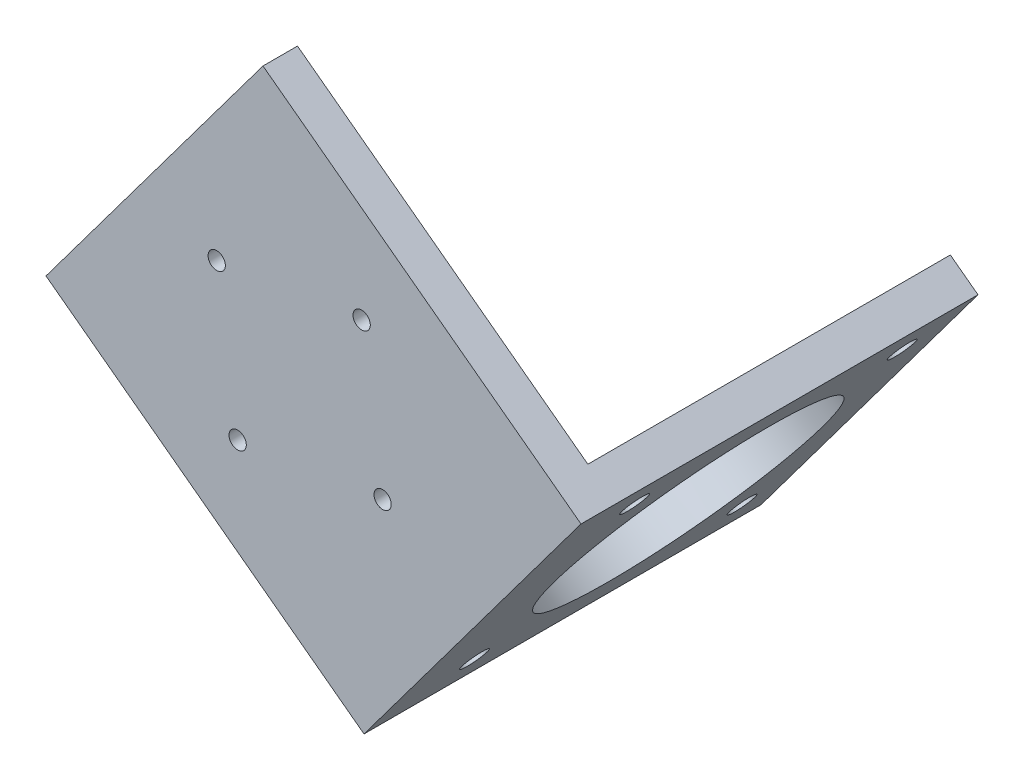
ISO-10303-21;
HEADER;
FILE_DESCRIPTION(('STEP AP214'),'2;1');
FILE_NAME('part.step','',(''),(''),'','','');
FILE_SCHEMA(('AUTOMOTIVE_DESIGN { 1 0 10303 214 1 1 1 1 }'));
ENDSEC;
DATA;
#1=APPLICATION_CONTEXT('core data for automotive mechanical design processes');
#2=APPLICATION_PROTOCOL_DEFINITION('international standard','automotive_design',2000,#1);
#3=PRODUCT_CONTEXT('',#1,'mechanical');
#4=PRODUCT('Part','Part','',(#3));
#5=PRODUCT_RELATED_PRODUCT_CATEGORY('part','',(#4));
#6=PRODUCT_DEFINITION_FORMATION('','',#4);
#7=PRODUCT_DEFINITION_CONTEXT('part definition',#1,'design');
#8=PRODUCT_DEFINITION('design','',#6,#7);
#9=PRODUCT_DEFINITION_SHAPE('','',#8);
#10=(LENGTH_UNIT() NAMED_UNIT(*) SI_UNIT(.MILLI.,.METRE.));
#11=(NAMED_UNIT(*) PLANE_ANGLE_UNIT() SI_UNIT($,.RADIAN.));
#12=(NAMED_UNIT(*) SI_UNIT($,.STERADIAN.) SOLID_ANGLE_UNIT());
#13=UNCERTAINTY_MEASURE_WITH_UNIT(LENGTH_MEASURE(1.E-05),#10,'distance_accuracy_value','');
#14=(GEOMETRIC_REPRESENTATION_CONTEXT(3) GLOBAL_UNCERTAINTY_ASSIGNED_CONTEXT((#13)) GLOBAL_UNIT_ASSIGNED_CONTEXT((#10,
#11,#12)) REPRESENTATION_CONTEXT('',''));
#15=CARTESIAN_POINT('',(0.,0.,0.));
#16=DIRECTION('',(0.,0.,1.));
#17=DIRECTION('',(1.,0.,0.));
#18=AXIS2_PLACEMENT_3D('',#15,#16,#17);
#19=CARTESIAN_POINT('',(20.0260095295566,-14.9652578434889,0.));
#20=DIRECTION('',(0.801040381182265,-0.598610313739558,0.));
#21=DIRECTION('',(0.598610313739558,0.801040381182265,0.));
#22=AXIS2_PLACEMENT_3D('',#19,#20,#21);
#23=PLANE('',#22);
#24=CARTESIAN_POINT('',(29.3044693925198,-2.54913193516381,-27.5));
#25=DIRECTION('',(-0.801040381182265,0.598610313739557,0.));
#26=DIRECTION('',(-0.598610313739557,-0.801040381182265,0.));
#27=AXIS2_PLACEMENT_3D('',#24,#25,#26);
#28=CIRCLE('',#27,1.5);
#29=CARTESIAN_POINT('',(28.4065539219104,-3.75069250693721,-27.5));
#30=VERTEX_POINT('',#29);
#31=EDGE_CURVE('E158',#30,#30,#28,.T.);
#32=ORIENTED_EDGE('',*,*,#31,.T.);
#33=EDGE_LOOP('',(#32));
#34=FACE_BOUND('',#33,.T.);
#35=CARTESIAN_POINT('',(10.7475496665935,-27.381383751814,-27.5));
#36=DIRECTION('',(0.801040381182265,-0.598610313739557,0.));
#37=DIRECTION('',(0.598610313739557,0.801040381182265,0.));
#38=AXIS2_PLACEMENT_3D('',#35,#36,#37);
#39=CIRCLE('',#38,1.5);
#40=CARTESIAN_POINT('',(11.6454651372028,-26.1798231800406,-27.5));
#41=VERTEX_POINT('',#40);
#42=EDGE_CURVE('E152',#41,#41,#39,.T.);
#43=ORIENTED_EDGE('',*,*,#42,.F.);
#44=EDGE_LOOP('',(#43));
#45=FACE_BOUND('',#44,.T.);
#46=CARTESIAN_POINT('',(20.0260095295566,-14.9652578434889,-43.));
#47=DIRECTION('',(0.801040381182265,-0.598610313739557,0.));
#48=DIRECTION('',(0.598610313739557,0.801040381182265,0.));
#49=AXIS2_PLACEMENT_3D('',#46,#47,#48);
#50=CIRCLE('',#49,15.5);
#51=CARTESIAN_POINT('',(29.3044693925198,-2.54913193516381,-43.));
#52=VERTEX_POINT('',#51);
#53=EDGE_CURVE('E139',#52,#52,#50,.T.);
#54=ORIENTED_EDGE('',*,*,#53,.F.);
#55=EDGE_LOOP('',(#54));
#56=FACE_BOUND('',#55,.T.);
#57=DIRECTION('',(0.,0.,1.));
#58=VECTOR('',#57,1.);
#59=CARTESIAN_POINT('',(32.5968261180874,1.85659016133868,-22.));
#60=LINE('',#59,#58);
#61=CARTESIAN_POINT('',(32.5968261180874,1.85659016133868,-64.));
#62=VERTEX_POINT('',#61);
#63=CARTESIAN_POINT('',(32.5968261180874,1.85659016133868,-18.));
#64=VERTEX_POINT('',#63);
#65=EDGE_CURVE('E130',#62,#64,#60,.T.);
#66=ORIENTED_EDGE('',*,*,#65,.T.);
#67=DIRECTION('',(-0.598610313739558,-0.801040381182265,0.));
#68=VECTOR('',#67,1.);
#69=CARTESIAN_POINT('',(32.5968261180874,1.85659016133868,-18.));
#70=LINE('',#69,#68);
#71=CARTESIAN_POINT('',(7.45519294102592,-31.7871058483165,-18.));
#72=VERTEX_POINT('',#71);
#73=EDGE_CURVE('E93',#64,#72,#70,.T.);
#74=ORIENTED_EDGE('',*,*,#73,.T.);
#75=DIRECTION('',(0.,0.,-1.));
#76=VECTOR('',#75,1.);
#77=CARTESIAN_POINT('',(7.45519294102592,-31.7871058483165,-18.));
#78=LINE('',#77,#76);
#79=CARTESIAN_POINT('',(7.45519294102592,-31.7871058483165,-64.));
#80=VERTEX_POINT('',#79);
#81=EDGE_CURVE('E124',#72,#80,#78,.T.);
#82=ORIENTED_EDGE('',*,*,#81,.T.);
#83=DIRECTION('',(0.598610313739558,0.801040381182265,0.));
#84=VECTOR('',#83,1.);
#85=CARTESIAN_POINT('',(7.45519294102592,-31.7871058483165,-64.));
#86=LINE('',#85,#84);
#87=EDGE_CURVE('E142',#80,#62,#86,.T.);
#88=ORIENTED_EDGE('',*,*,#87,.T.);
#89=EDGE_LOOP('',(#66,#74,#82,#88));
#90=FACE_BOUND('',#89,.T.);
#91=CARTESIAN_POINT('',(29.3044693925198,-2.54913193516381,-58.5));
#92=DIRECTION('',(0.801040381182265,-0.598610313739557,0.));
#93=DIRECTION('',(0.598610313739557,0.801040381182265,0.));
#94=AXIS2_PLACEMENT_3D('',#91,#92,#93);
#95=CIRCLE('',#94,1.5);
#96=CARTESIAN_POINT('',(30.2023848631291,-1.34757136339041,-58.5));
#97=VERTEX_POINT('',#96);
#98=EDGE_CURVE('E164',#97,#97,#95,.T.);
#99=ORIENTED_EDGE('',*,*,#98,.F.);
#100=EDGE_LOOP('',(#99));
#101=FACE_BOUND('',#100,.T.);
#102=CARTESIAN_POINT('',(10.7475496665935,-27.381383751814,-58.5));
#103=DIRECTION('',(-0.801040381182265,0.598610313739557,0.));
#104=DIRECTION('',(-0.598610313739557,-0.801040381182265,0.));
#105=AXIS2_PLACEMENT_3D('',#102,#103,#104);
#106=CIRCLE('',#105,1.5);
#107=CARTESIAN_POINT('',(9.84963419598415,-28.5829443235874,-58.5));
#108=VERTEX_POINT('',#107);
#109=EDGE_CURVE('E161',#108,#108,#106,.T.);
#110=ORIENTED_EDGE('',*,*,#109,.T.);
#111=EDGE_LOOP('',(#110));
#112=FACE_BOUND('',#111,.T.);
#113=ADVANCED_FACE('F35',(#34,#45,#56,#90,#101,#112),#23,.T.);
#114=CARTESIAN_POINT('',(29.3926645933583,4.25103141629692,-64.));
#115=DIRECTION('',(-0.801040381182265,0.598610313739557,0.));
#116=DIRECTION('',(-0.598610313739557,-0.801040381182266,0.));
#117=AXIS2_PLACEMENT_3D('',#114,#115,#116);
#118=PLANE('',#117);
#119=CARTESIAN_POINT('',(26.1003078677907,-0.154690680205571,-27.5));
#120=DIRECTION('',(-0.801040381182265,0.598610313739557,0.));
#121=DIRECTION('',(-0.598610313739557,-0.801040381182266,0.));
#122=AXIS2_PLACEMENT_3D('',#119,#120,#121);
#123=CIRCLE('',#122,1.5);
#124=CARTESIAN_POINT('',(25.2023923971814,-1.35625125197897,-27.5));
#125=VERTEX_POINT('',#124);
#126=EDGE_CURVE('E173',#125,#125,#123,.T.);
#127=ORIENTED_EDGE('',*,*,#126,.F.);
#128=EDGE_LOOP('',(#127));
#129=FACE_BOUND('',#128,.T.);
#130=CARTESIAN_POINT('',(7.54338814186444,-24.9869424968558,-27.5));
#131=DIRECTION('',(-0.801040381182265,0.598610313739557,0.));
#132=DIRECTION('',(-0.598610313739557,-0.801040381182266,0.));
#133=AXIS2_PLACEMENT_3D('',#130,#131,#132);
#134=CIRCLE('',#133,1.5);
#135=CARTESIAN_POINT('',(6.6454726712551,-26.1885030686292,-27.5));
#136=VERTEX_POINT('',#135);
#137=EDGE_CURVE('E155',#136,#136,#134,.F.);
#138=ORIENTED_EDGE('',*,*,#137,.T.);
#139=EDGE_LOOP('',(#138));
#140=FACE_BOUND('',#139,.T.);
#141=CARTESIAN_POINT('',(16.8218480048276,-12.5708165885307,-43.));
#142=DIRECTION('',(-0.801040381182265,0.598610313739557,0.));
#143=DIRECTION('',(-0.598610313739557,-0.801040381182266,0.));
#144=AXIS2_PLACEMENT_3D('',#141,#142,#143);
#145=CIRCLE('',#144,15.5);
#146=CARTESIAN_POINT('',(7.54338814186444,-24.9869424968558,-43.));
#147=VERTEX_POINT('',#146);
#148=EDGE_CURVE('E149',#147,#147,#145,.F.);
#149=ORIENTED_EDGE('',*,*,#148,.T.);
#150=EDGE_LOOP('',(#149));
#151=FACE_BOUND('',#150,.T.);
#152=DIRECTION('',(-0.598610313739557,-0.801040381182266,0.));
#153=VECTOR('',#152,1.);
#154=CARTESIAN_POINT('',(29.3926645933583,4.25103141629692,-22.));
#155=LINE('',#154,#153);
#156=CARTESIAN_POINT('',(29.3926645933583,4.25103141629692,-22.));
#157=VERTEX_POINT('',#156);
#158=CARTESIAN_POINT('',(4.25103141629688,-29.3926645933583,-22.));
#159=VERTEX_POINT('',#158);
#160=EDGE_CURVE('E136',#157,#159,#155,.T.);
#161=ORIENTED_EDGE('',*,*,#160,.F.);
#162=DIRECTION('',(0.,0.,1.));
#163=VECTOR('',#162,1.);
#164=CARTESIAN_POINT('',(29.3926645933583,4.25103141629692,-64.));
#165=LINE('',#164,#163);
#166=CARTESIAN_POINT('',(29.3926645933583,4.25103141629692,-64.));
#167=VERTEX_POINT('',#166);
#168=EDGE_CURVE('E132',#167,#157,#165,.T.);
#169=ORIENTED_EDGE('',*,*,#168,.F.);
#170=DIRECTION('',(-0.598610313739557,-0.801040381182266,0.));
#171=VECTOR('',#170,1.);
#172=CARTESIAN_POINT('',(29.3926645933583,4.25103141629692,-64.));
#173=LINE('',#172,#171);
#174=CARTESIAN_POINT('',(4.25103141629687,-29.3926645933583,-64.));
#175=VERTEX_POINT('',#174);
#176=EDGE_CURVE('E138',#167,#175,#173,.T.);
#177=ORIENTED_EDGE('',*,*,#176,.T.);
#178=DIRECTION('',(0.,0.,1.));
#179=VECTOR('',#178,1.);
#180=CARTESIAN_POINT('',(4.25103141629687,-29.3926645933583,-64.));
#181=LINE('',#180,#179);
#182=EDGE_CURVE('E50',#175,#159,#181,.T.);
#183=ORIENTED_EDGE('',*,*,#182,.T.);
#184=EDGE_LOOP('',(#161,#169,#177,#183));
#185=FACE_BOUND('',#184,.T.);
#186=CARTESIAN_POINT('',(26.1003078677907,-0.154690680205571,-58.5));
#187=DIRECTION('',(-0.801040381182265,0.598610313739557,0.));
#188=DIRECTION('',(-0.598610313739557,-0.801040381182266,0.));
#189=AXIS2_PLACEMENT_3D('',#186,#187,#188);
#190=CIRCLE('',#189,1.5);
#191=CARTESIAN_POINT('',(25.2023923971814,-1.35625125197897,-58.5));
#192=VERTEX_POINT('',#191);
#193=EDGE_CURVE('E170',#192,#192,#190,.F.);
#194=ORIENTED_EDGE('',*,*,#193,.T.);
#195=EDGE_LOOP('',(#194));
#196=FACE_BOUND('',#195,.T.);
#197=CARTESIAN_POINT('',(7.54338814186444,-24.9869424968558,-58.5));
#198=DIRECTION('',(-0.801040381182265,0.598610313739557,0.));
#199=DIRECTION('',(-0.598610313739557,-0.801040381182266,0.));
#200=AXIS2_PLACEMENT_3D('',#197,#198,#199);
#201=CIRCLE('',#200,1.5);
#202=CARTESIAN_POINT('',(6.6454726712551,-26.1885030686292,-58.5));
#203=VERTEX_POINT('',#202);
#204=EDGE_CURVE('E165',#203,#203,#201,.T.);
#205=ORIENTED_EDGE('',*,*,#204,.F.);
#206=EDGE_LOOP('',(#205));
#207=FACE_BOUND('',#206,.T.);
#208=ADVANCED_FACE('F182',(#129,#140,#151,#185,#196,#207),#118,.T.);
#209=CARTESIAN_POINT('',(0.,0.,-22.));
#210=DIRECTION('',(0.,0.,1.));
#211=DIRECTION('',(1.,0.,0.));
#212=AXIS2_PLACEMENT_3D('',#209,#210,#211);
#213=PLANE('',#212);
#214=DIRECTION('',(0.801040381182265,-0.598610313739557,0.));
#215=VECTOR('',#214,1.);
#216=CARTESIAN_POINT('',(29.3926645933583,4.25103141629692,-22.));
#217=LINE('',#216,#215);
#218=CARTESIAN_POINT('',(-4.25103141629687,29.3926645933583,-22.));
#219=VERTEX_POINT('',#218);
#220=EDGE_CURVE('E89',#219,#157,#217,.T.);
#221=ORIENTED_EDGE('',*,*,#220,.T.);
#222=ORIENTED_EDGE('',*,*,#160,.T.);
#223=DIRECTION('',(-0.801040381182266,0.598610313739557,0.));
#224=VECTOR('',#223,1.);
#225=CARTESIAN_POINT('',(4.25103141629686,-29.3926645933583,-22.));
#226=LINE('',#225,#224);
#227=CARTESIAN_POINT('',(-29.3926645933583,-4.25103141629686,-22.));
#228=VERTEX_POINT('',#227);
#229=EDGE_CURVE('E95',#159,#228,#226,.T.);
#230=ORIENTED_EDGE('',*,*,#229,.T.);
#231=DIRECTION('',(0.598610313739557,0.801040381182265,0.));
#232=VECTOR('',#231,1.);
#233=CARTESIAN_POINT('',(-29.3926645933583,-4.25103141629686,-22.));
#234=LINE('',#233,#232);
#235=EDGE_CURVE('E59',#228,#219,#234,.T.);
#236=ORIENTED_EDGE('',*,*,#235,.T.);
#237=EDGE_LOOP('',(#221,#222,#230,#236));
#238=FACE_BOUND('',#237,.T.);
#239=CARTESIAN_POINT('',(-9.61248457418721,7.18332376487468,-22.));
#240=DIRECTION('',(0.,0.,-1.));
#241=DIRECTION('',(-1.,0.,0.));
#242=AXIS2_PLACEMENT_3D('',#239,#240,#241);
#243=CIRCLE('',#242,0.999999999999998);
#244=CARTESIAN_POINT('',(-10.6124845741872,7.18332376487468,-22.));
#245=VERTEX_POINT('',#244);
#246=EDGE_CURVE('E100',#245,#245,#243,.T.);
#247=ORIENTED_EDGE('',*,*,#246,.F.);
#248=EDGE_LOOP('',(#247));
#249=FACE_BOUND('',#248,.T.);
#250=CARTESIAN_POINT('',(7.18332376487465,9.61248457418721,-22.));
#251=DIRECTION('',(0.,0.,-1.));
#252=DIRECTION('',(-1.,0.,0.));
#253=AXIS2_PLACEMENT_3D('',#250,#251,#252);
#254=CIRCLE('',#253,1.);
#255=CARTESIAN_POINT('',(6.18332376487465,9.61248457418721,-22.));
#256=VERTEX_POINT('',#255);
#257=EDGE_CURVE('E106',#256,#256,#254,.T.);
#258=ORIENTED_EDGE('',*,*,#257,.F.);
#259=EDGE_LOOP('',(#258));
#260=FACE_BOUND('',#259,.T.);
#261=CARTESIAN_POINT('',(9.61248457418719,-7.18332376487465,-22.));
#262=DIRECTION('',(0.,0.,-1.));
#263=DIRECTION('',(-1.,0.,0.));
#264=AXIS2_PLACEMENT_3D('',#261,#262,#263);
#265=CIRCLE('',#264,1.);
#266=CARTESIAN_POINT('',(8.61248457418718,-7.18332376487465,-22.));
#267=VERTEX_POINT('',#266);
#268=EDGE_CURVE('E112',#267,#267,#265,.T.);
#269=ORIENTED_EDGE('',*,*,#268,.F.);
#270=EDGE_LOOP('',(#269));
#271=FACE_BOUND('',#270,.T.);
#272=CARTESIAN_POINT('',(-7.18332376487468,-9.61248457418718,-22.));
#273=DIRECTION('',(0.,0.,-1.));
#274=DIRECTION('',(-1.,0.,0.));
#275=AXIS2_PLACEMENT_3D('',#272,#273,#274);
#276=CIRCLE('',#275,0.999999999999997);
#277=CARTESIAN_POINT('',(-8.18332376487468,-9.61248457418718,-22.));
#278=VERTEX_POINT('',#277);
#279=EDGE_CURVE('E118',#278,#278,#276,.T.);
#280=ORIENTED_EDGE('',*,*,#279,.F.);
#281=EDGE_LOOP('',(#280));
#282=FACE_BOUND('',#281,.T.);
#283=ADVANCED_FACE('F185',(#238,#249,#260,#271,#282),#213,.F.);
#284=CARTESIAN_POINT('',(0.,0.,-18.));
#285=DIRECTION('',(0.,0.,1.));
#286=DIRECTION('',(1.,0.,0.));
#287=AXIS2_PLACEMENT_3D('',#284,#285,#286);
#288=PLANE('',#287);
#289=CARTESIAN_POINT('',(9.61248457418719,-7.18332376487465,-18.));
#290=DIRECTION('',(0.,0.,-1.));
#291=DIRECTION('',(-1.,0.,0.));
#292=AXIS2_PLACEMENT_3D('',#289,#290,#291);
#293=CIRCLE('',#292,1.);
#294=CARTESIAN_POINT('',(8.61248457418718,-7.18332376487465,-18.));
#295=VERTEX_POINT('',#294);
#296=EDGE_CURVE('E115',#295,#295,#293,.T.);
#297=ORIENTED_EDGE('',*,*,#296,.T.);
#298=EDGE_LOOP('',(#297));
#299=FACE_BOUND('',#298,.T.);
#300=CARTESIAN_POINT('',(-9.61248457418721,7.18332376487468,-18.));
#301=DIRECTION('',(0.,0.,-1.));
#302=DIRECTION('',(-1.,0.,0.));
#303=AXIS2_PLACEMENT_3D('',#300,#301,#302);
#304=CIRCLE('',#303,0.999999999999998);
#305=CARTESIAN_POINT('',(-10.6124845741872,7.18332376487468,-18.));
#306=VERTEX_POINT('',#305);
#307=EDGE_CURVE('E103',#306,#306,#304,.T.);
#308=ORIENTED_EDGE('',*,*,#307,.T.);
#309=EDGE_LOOP('',(#308));
#310=FACE_BOUND('',#309,.T.);
#311=DIRECTION('',(-0.801040381182266,0.598610313739557,0.));
#312=VECTOR('',#311,1.);
#313=CARTESIAN_POINT('',(4.25103141629686,-29.3926645933583,-18.));
#314=LINE('',#313,#312);
#315=CARTESIAN_POINT('',(-29.3926645933583,-4.25103141629686,-18.));
#316=VERTEX_POINT('',#315);
#317=EDGE_CURVE('E80',#72,#316,#314,.T.);
#318=ORIENTED_EDGE('',*,*,#317,.F.);
#319=ORIENTED_EDGE('',*,*,#73,.F.);
#320=DIRECTION('',(0.801040381182265,-0.598610313739557,0.));
#321=VECTOR('',#320,1.);
#322=CARTESIAN_POINT('',(29.3926645933583,4.25103141629692,-18.));
#323=LINE('',#322,#321);
#324=CARTESIAN_POINT('',(-4.25103141629687,29.3926645933583,-18.));
#325=VERTEX_POINT('',#324);
#326=EDGE_CURVE('E79',#325,#64,#323,.T.);
#327=ORIENTED_EDGE('',*,*,#326,.F.);
#328=DIRECTION('',(0.598610313739557,0.801040381182265,0.));
#329=VECTOR('',#328,1.);
#330=CARTESIAN_POINT('',(-29.3926645933583,-4.25103141629686,-18.));
#331=LINE('',#330,#329);
#332=EDGE_CURVE('E71',#316,#325,#331,.T.);
#333=ORIENTED_EDGE('',*,*,#332,.F.);
#334=EDGE_LOOP('',(#318,#319,#327,#333));
#335=FACE_BOUND('',#334,.T.);
#336=CARTESIAN_POINT('',(7.18332376487465,9.61248457418721,-18.));
#337=DIRECTION('',(0.,0.,-1.));
#338=DIRECTION('',(-1.,0.,0.));
#339=AXIS2_PLACEMENT_3D('',#336,#337,#338);
#340=CIRCLE('',#339,1.);
#341=CARTESIAN_POINT('',(6.18332376487465,9.61248457418721,-18.));
#342=VERTEX_POINT('',#341);
#343=EDGE_CURVE('E109',#342,#342,#340,.T.);
#344=ORIENTED_EDGE('',*,*,#343,.T.);
#345=EDGE_LOOP('',(#344));
#346=FACE_BOUND('',#345,.T.);
#347=CARTESIAN_POINT('',(-7.18332376487468,-9.61248457418718,-18.));
#348=DIRECTION('',(0.,0.,-1.));
#349=DIRECTION('',(-1.,0.,0.));
#350=AXIS2_PLACEMENT_3D('',#347,#348,#349);
#351=CIRCLE('',#350,0.999999999999997);
#352=CARTESIAN_POINT('',(-8.18332376487468,-9.61248457418718,-18.));
#353=VERTEX_POINT('',#352);
#354=EDGE_CURVE('E121',#353,#353,#351,.T.);
#355=ORIENTED_EDGE('',*,*,#354,.T.);
#356=EDGE_LOOP('',(#355));
#357=FACE_BOUND('',#356,.T.);
#358=ADVANCED_FACE('F90',(#299,#310,#335,#346,#357),#288,.T.);
#359=CARTESIAN_POINT('',(4.25103141629686,-29.3926645933583,-22.));
#360=DIRECTION('',(0.598610313739557,0.801040381182266,0.));
#361=DIRECTION('',(-0.801040381182266,0.598610313739557,0.));
#362=AXIS2_PLACEMENT_3D('',#359,#360,#361);
#363=PLANE('',#362);
#364=ORIENTED_EDGE('',*,*,#317,.T.);
#365=DIRECTION('',(0.,0.,1.));
#366=VECTOR('',#365,1.);
#367=CARTESIAN_POINT('',(-29.3926645933583,-4.25103141629686,-22.));
#368=LINE('',#367,#366);
#369=EDGE_CURVE('E11',#228,#316,#368,.T.);
#370=ORIENTED_EDGE('',*,*,#369,.F.);
#371=ORIENTED_EDGE('',*,*,#229,.F.);
#372=ORIENTED_EDGE('',*,*,#182,.F.);
#373=DIRECTION('',(0.801040381182266,-0.598610313739556,0.));
#374=VECTOR('',#373,1.);
#375=CARTESIAN_POINT('',(4.25103141629687,-29.3926645933583,-64.));
#376=LINE('',#375,#374);
#377=EDGE_CURVE('E145',#175,#80,#376,.T.);
#378=ORIENTED_EDGE('',*,*,#377,.T.);
#379=ORIENTED_EDGE('',*,*,#81,.F.);
#380=EDGE_LOOP('',(#364,#370,#371,#372,#378,#379));
#381=FACE_BOUND('',#380,.T.);
#382=ADVANCED_FACE('F37',(#381),#363,.F.);
#383=CARTESIAN_POINT('',(-29.3926645933583,-4.25103141629686,-22.));
#384=DIRECTION('',(0.801040381182265,-0.598610313739557,0.));
#385=DIRECTION('',(0.598610313739557,0.801040381182265,0.));
#386=AXIS2_PLACEMENT_3D('',#383,#384,#385);
#387=PLANE('',#386);
#388=ORIENTED_EDGE('',*,*,#332,.T.);
#389=DIRECTION('',(0.,0.,1.));
#390=VECTOR('',#389,1.);
#391=CARTESIAN_POINT('',(-4.25103141629687,29.3926645933583,-22.));
#392=LINE('',#391,#390);
#393=EDGE_CURVE('E43',#219,#325,#392,.T.);
#394=ORIENTED_EDGE('',*,*,#393,.F.);
#395=ORIENTED_EDGE('',*,*,#235,.F.);
#396=ORIENTED_EDGE('',*,*,#369,.T.);
#397=EDGE_LOOP('',(#388,#394,#395,#396));
#398=FACE_BOUND('',#397,.T.);
#399=ADVANCED_FACE('F73',(#398),#387,.F.);
#400=CARTESIAN_POINT('',(29.3926645933583,4.25103141629692,-22.));
#401=DIRECTION('',(-0.598610313739557,-0.801040381182265,0.));
#402=DIRECTION('',(0.801040381182265,-0.598610313739557,0.));
#403=AXIS2_PLACEMENT_3D('',#400,#401,#402);
#404=PLANE('',#403);
#405=ORIENTED_EDGE('',*,*,#326,.T.);
#406=ORIENTED_EDGE('',*,*,#65,.F.);
#407=DIRECTION('',(-0.801040381182264,0.598610313739559,0.));
#408=VECTOR('',#407,1.);
#409=CARTESIAN_POINT('',(32.5968261180874,1.85659016133868,-64.));
#410=LINE('',#409,#408);
#411=EDGE_CURVE('E134',#62,#167,#410,.T.);
#412=ORIENTED_EDGE('',*,*,#411,.T.);
#413=ORIENTED_EDGE('',*,*,#168,.T.);
#414=ORIENTED_EDGE('',*,*,#220,.F.);
#415=ORIENTED_EDGE('',*,*,#393,.T.);
#416=EDGE_LOOP('',(#405,#406,#412,#413,#414,#415));
#417=FACE_BOUND('',#416,.T.);
#418=ADVANCED_FACE('F84',(#417),#404,.F.);
#419=CARTESIAN_POINT('',(-9.61248457418721,7.18332376487468,-22.));
#420=DIRECTION('',(0.,0.,1.));
#421=DIRECTION('',(1.,0.,0.));
#422=AXIS2_PLACEMENT_3D('',#419,#420,#421);
#423=CYLINDRICAL_SURFACE('',#422,0.999999999999998);
#424=ORIENTED_EDGE('',*,*,#246,.T.);
#425=EDGE_LOOP('',(#424));
#426=FACE_BOUND('',#425,.T.);
#427=ORIENTED_EDGE('',*,*,#307,.F.);
#428=EDGE_LOOP('',(#427));
#429=FACE_BOUND('',#428,.T.);
#430=ADVANCED_FACE('F224',(#426,#429),#423,.F.);
#431=CARTESIAN_POINT('',(7.18332376487465,9.61248457418721,-22.));
#432=DIRECTION('',(0.,0.,1.));
#433=DIRECTION('',(1.,0.,0.));
#434=AXIS2_PLACEMENT_3D('',#431,#432,#433);
#435=CYLINDRICAL_SURFACE('',#434,1.);
#436=ORIENTED_EDGE('',*,*,#257,.T.);
#437=EDGE_LOOP('',(#436));
#438=FACE_BOUND('',#437,.T.);
#439=ORIENTED_EDGE('',*,*,#343,.F.);
#440=EDGE_LOOP('',(#439));
#441=FACE_BOUND('',#440,.T.);
#442=ADVANCED_FACE('F220',(#438,#441),#435,.F.);
#443=CARTESIAN_POINT('',(9.61248457418719,-7.18332376487465,-22.));
#444=DIRECTION('',(0.,0.,1.));
#445=DIRECTION('',(1.,0.,0.));
#446=AXIS2_PLACEMENT_3D('',#443,#444,#445);
#447=CYLINDRICAL_SURFACE('',#446,1.);
#448=ORIENTED_EDGE('',*,*,#268,.T.);
#449=EDGE_LOOP('',(#448));
#450=FACE_BOUND('',#449,.T.);
#451=ORIENTED_EDGE('',*,*,#296,.F.);
#452=EDGE_LOOP('',(#451));
#453=FACE_BOUND('',#452,.T.);
#454=ADVANCED_FACE('F216',(#450,#453),#447,.F.);
#455=CARTESIAN_POINT('',(-7.18332376487468,-9.61248457418718,-22.));
#456=DIRECTION('',(0.,0.,1.));
#457=DIRECTION('',(1.,0.,0.));
#458=AXIS2_PLACEMENT_3D('',#455,#456,#457);
#459=CYLINDRICAL_SURFACE('',#458,0.999999999999997);
#460=ORIENTED_EDGE('',*,*,#279,.T.);
#461=EDGE_LOOP('',(#460));
#462=FACE_BOUND('',#461,.T.);
#463=ORIENTED_EDGE('',*,*,#354,.F.);
#464=EDGE_LOOP('',(#463));
#465=FACE_BOUND('',#464,.T.);
#466=ADVANCED_FACE('F212',(#462,#465),#459,.F.);
#467=CARTESIAN_POINT('',(0.,0.,-64.));
#468=DIRECTION('',(0.,0.,1.));
#469=DIRECTION('',(1.,0.,0.));
#470=AXIS2_PLACEMENT_3D('',#467,#468,#469);
#471=PLANE('',#470);
#472=ORIENTED_EDGE('',*,*,#176,.F.);
#473=ORIENTED_EDGE('',*,*,#411,.F.);
#474=ORIENTED_EDGE('',*,*,#87,.F.);
#475=ORIENTED_EDGE('',*,*,#377,.F.);
#476=EDGE_LOOP('',(#472,#473,#474,#475));
#477=FACE_BOUND('',#476,.T.);
#478=ADVANCED_FACE('F215',(#477),#471,.F.);
#479=CARTESIAN_POINT('',(-32.9554926392791,24.6273449524785,-43.));
#480=DIRECTION('',(0.801040381182265,-0.598610313739557,0.));
#481=DIRECTION('',(0.598610313739557,0.801040381182265,0.));
#482=AXIS2_PLACEMENT_3D('',#479,#480,#481);
#483=CYLINDRICAL_SURFACE('',#482,15.5);
#484=ORIENTED_EDGE('',*,*,#148,.F.);
#485=EDGE_LOOP('',(#484));
#486=FACE_BOUND('',#485,.T.);
#487=ORIENTED_EDGE('',*,*,#53,.T.);
#488=EDGE_LOOP('',(#487));
#489=FACE_BOUND('',#488,.T.);
#490=ADVANCED_FACE('F262',(#486,#489),#483,.F.);
#491=CARTESIAN_POINT('',(-42.2339525022423,12.2112190441534,-27.5));
#492=DIRECTION('',(0.801040381182265,-0.598610313739557,0.));
#493=DIRECTION('',(0.598610313739557,0.801040381182265,0.));
#494=AXIS2_PLACEMENT_3D('',#491,#492,#493);
#495=CYLINDRICAL_SURFACE('',#494,1.5);
#496=ORIENTED_EDGE('',*,*,#137,.F.);
#497=EDGE_LOOP('',(#496));
#498=FACE_BOUND('',#497,.T.);
#499=ORIENTED_EDGE('',*,*,#42,.T.);
#500=EDGE_LOOP('',(#499));
#501=FACE_BOUND('',#500,.T.);
#502=ADVANCED_FACE('F266',(#498,#501),#495,.F.);
#503=CARTESIAN_POINT('',(-23.677032776316,37.0434708608037,-27.5));
#504=DIRECTION('',(0.801040381182265,-0.598610313739557,0.));
#505=DIRECTION('',(0.598610313739557,0.801040381182265,0.));
#506=AXIS2_PLACEMENT_3D('',#503,#504,#505);
#507=CYLINDRICAL_SURFACE('',#506,1.5);
#508=ORIENTED_EDGE('',*,*,#126,.T.);
#509=EDGE_LOOP('',(#508));
#510=FACE_BOUND('',#509,.T.);
#511=ORIENTED_EDGE('',*,*,#31,.F.);
#512=EDGE_LOOP('',(#511));
#513=FACE_BOUND('',#512,.T.);
#514=ADVANCED_FACE('F179',(#510,#513),#507,.F.);
#515=CARTESIAN_POINT('',(-23.677032776316,37.0434708608037,-58.5));
#516=DIRECTION('',(0.801040381182265,-0.598610313739557,0.));
#517=DIRECTION('',(0.598610313739557,0.801040381182265,0.));
#518=AXIS2_PLACEMENT_3D('',#515,#516,#517);
#519=CYLINDRICAL_SURFACE('',#518,1.5);
#520=ORIENTED_EDGE('',*,*,#193,.F.);
#521=EDGE_LOOP('',(#520));
#522=FACE_BOUND('',#521,.T.);
#523=ORIENTED_EDGE('',*,*,#98,.T.);
#524=EDGE_LOOP('',(#523));
#525=FACE_BOUND('',#524,.T.);
#526=ADVANCED_FACE('F200',(#522,#525),#519,.F.);
#527=CARTESIAN_POINT('',(-42.2339525022423,12.2112190441534,-58.5));
#528=DIRECTION('',(0.801040381182265,-0.598610313739557,0.));
#529=DIRECTION('',(0.598610313739557,0.801040381182265,0.));
#530=AXIS2_PLACEMENT_3D('',#527,#528,#529);
#531=CYLINDRICAL_SURFACE('',#530,1.5);
#532=ORIENTED_EDGE('',*,*,#204,.T.);
#533=EDGE_LOOP('',(#532));
#534=FACE_BOUND('',#533,.T.);
#535=ORIENTED_EDGE('',*,*,#109,.F.);
#536=EDGE_LOOP('',(#535));
#537=FACE_BOUND('',#536,.T.);
#538=ADVANCED_FACE('F197',(#534,#537),#531,.F.);
#539=CLOSED_SHELL('',(#113,#208,#283,#358,#382,#399,#418,#430,#442,#454,#466,#478,#490,#502,
#514,#526,#538));
#540=MANIFOLD_SOLID_BREP('B2',#539);
#541=ADVANCED_BREP_SHAPE_REPRESENTATION('',(#18,#540),#14);
#542=SHAPE_DEFINITION_REPRESENTATION(#9,#541);
ENDSEC;
END-ISO-10303-21;
